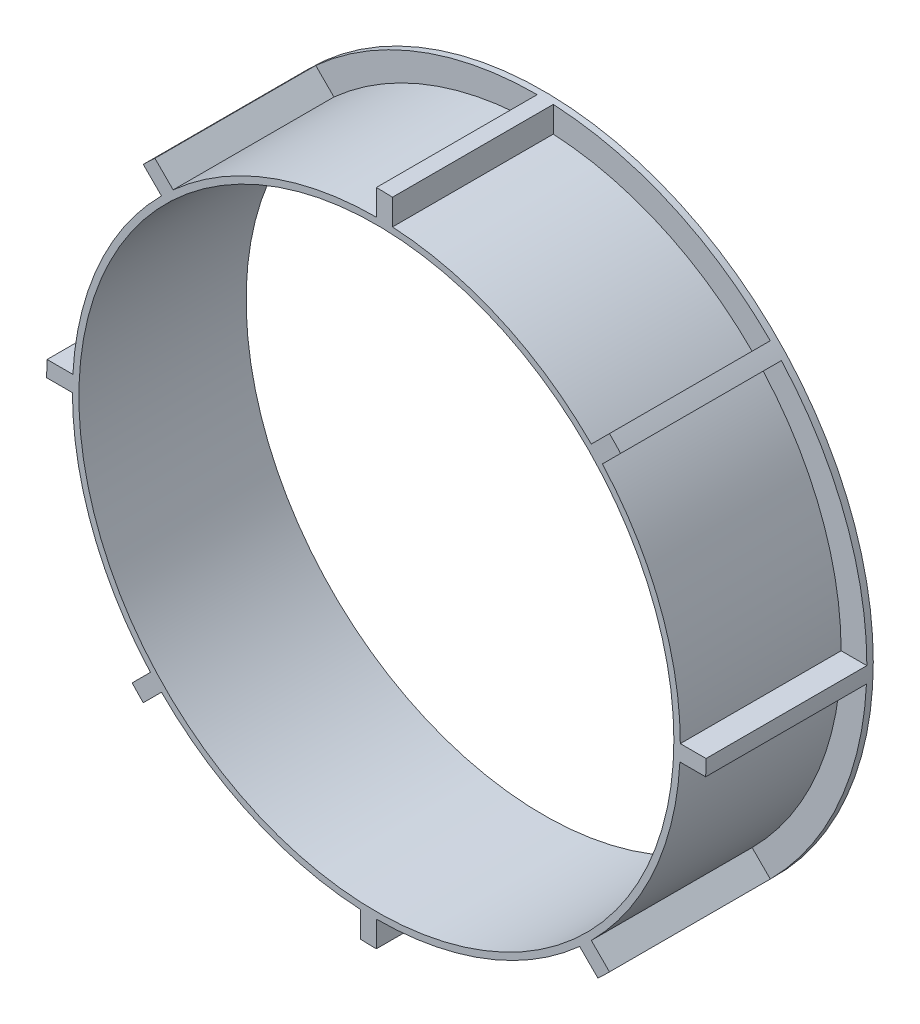
ISO-10303-21;
HEADER;
FILE_DESCRIPTION(('STEP AP214'),'2;1');
FILE_NAME('part.step','',(''),(''),'','','');
FILE_SCHEMA(('AUTOMOTIVE_DESIGN { 1 0 10303 214 1 1 1 1 }'));
ENDSEC;
DATA;
#1=APPLICATION_CONTEXT('core data for automotive mechanical design processes');
#2=APPLICATION_PROTOCOL_DEFINITION('international standard','automotive_design',2000,#1);
#3=PRODUCT_CONTEXT('',#1,'mechanical');
#4=PRODUCT('Part','Part','',(#3));
#5=PRODUCT_RELATED_PRODUCT_CATEGORY('part','',(#4));
#6=PRODUCT_DEFINITION_FORMATION('','',#4);
#7=PRODUCT_DEFINITION_CONTEXT('part definition',#1,'design');
#8=PRODUCT_DEFINITION('design','',#6,#7);
#9=PRODUCT_DEFINITION_SHAPE('','',#8);
#10=(LENGTH_UNIT() NAMED_UNIT(*) SI_UNIT(.MILLI.,.METRE.));
#11=(NAMED_UNIT(*) PLANE_ANGLE_UNIT() SI_UNIT($,.RADIAN.));
#12=(NAMED_UNIT(*) SI_UNIT($,.STERADIAN.) SOLID_ANGLE_UNIT());
#13=UNCERTAINTY_MEASURE_WITH_UNIT(LENGTH_MEASURE(1.E-05),#10,'distance_accuracy_value','');
#14=(GEOMETRIC_REPRESENTATION_CONTEXT(3) GLOBAL_UNCERTAINTY_ASSIGNED_CONTEXT((#13)) GLOBAL_UNIT_ASSIGNED_CONTEXT((#10,
#11,#12)) REPRESENTATION_CONTEXT('',''));
#15=CARTESIAN_POINT('',(0.,0.,0.));
#16=DIRECTION('',(0.,0.,1.));
#17=DIRECTION('',(1.,0.,0.));
#18=AXIS2_PLACEMENT_3D('',#15,#16,#17);
#19=CARTESIAN_POINT('',(0.,0.,2.));
#20=DIRECTION('',(0.,0.,1.));
#21=DIRECTION('',(1.,0.,0.));
#22=AXIS2_PLACEMENT_3D('',#19,#20,#21);
#23=PLANE('',#22);
#24=CARTESIAN_POINT('',(0.,0.,2.));
#25=DIRECTION('',(0.,0.,1.));
#26=DIRECTION('',(1.,0.,0.));
#27=AXIS2_PLACEMENT_3D('',#24,#25,#26);
#28=CIRCLE('',#27,102.5);
#29=CARTESIAN_POINT('',(0.,102.5,2.));
#30=VERTEX_POINT('',#29);
#31=CARTESIAN_POINT('',(-68.8566272719176,75.9276950837849,2.));
#32=VERTEX_POINT('',#31);
#33=EDGE_CURVE('E11',#30,#32,#28,.T.);
#34=ORIENTED_EDGE('',*,*,#33,.T.);
#35=DIRECTION('',(-0.707106781186539,0.707106781186556,0.));
#36=VECTOR('',#35,1.);
#37=CARTESIAN_POINT('',(3.53553390593278,3.53553390593269,2.));
#38=LINE('',#37,#36);
#39=CARTESIAN_POINT('',(-63.1924587208493,70.2635265327164,2.));
#40=VERTEX_POINT('',#39);
#41=EDGE_CURVE('E462',#40,#32,#38,.T.);
#42=ORIENTED_EDGE('',*,*,#41,.F.);
#43=CARTESIAN_POINT('',(0.,0.,2.));
#44=DIRECTION('',(0.,0.,1.));
#45=DIRECTION('',(1.,0.,0.));
#46=AXIS2_PLACEMENT_3D('',#43,#44,#45);
#47=CIRCLE('',#46,94.5);
#48=CARTESIAN_POINT('',(0.,94.5,2.));
#49=VERTEX_POINT('',#48);
#50=EDGE_CURVE('E265',#49,#40,#47,.T.);
#51=ORIENTED_EDGE('',*,*,#50,.F.);
#52=DIRECTION('',(0.,1.,0.));
#53=VECTOR('',#52,1.);
#54=CARTESIAN_POINT('',(0.,0.,2.));
#55=LINE('',#54,#53);
#56=EDGE_CURVE('E302',#49,#30,#55,.T.);
#57=ORIENTED_EDGE('',*,*,#56,.T.);
#58=EDGE_LOOP('',(#34,#42,#51,#57));
#59=FACE_BOUND('',#58,.T.);
#60=ADVANCED_FACE('F37',(#59),#23,.T.);
#61=CARTESIAN_POINT('',(0.,0.,52.));
#62=DIRECTION('',(0.,0.,-1.));
#63=DIRECTION('',(-1.,0.,0.));
#64=AXIS2_PLACEMENT_3D('',#61,#62,#63);
#65=CYLINDRICAL_SURFACE('',#64,94.5);
#66=DIRECTION('',(0.,0.,-1.));
#67=VECTOR('',#66,1.);
#68=CARTESIAN_POINT('',(-63.1924587208493,70.2635265327164,52.));
#69=LINE('',#68,#67);
#70=CARTESIAN_POINT('',(-63.1924587208493,70.2635265327164,52.));
#71=VERTEX_POINT('',#70);
#72=EDGE_CURVE('E249',#71,#40,#69,.T.);
#73=ORIENTED_EDGE('',*,*,#72,.F.);
#74=CARTESIAN_POINT('',(0.,0.,52.));
#75=DIRECTION('',(0.,0.,1.));
#76=DIRECTION('',(1.,0.,0.));
#77=AXIS2_PLACEMENT_3D('',#74,#75,#76);
#78=CIRCLE('',#77,94.5);
#79=CARTESIAN_POINT('',(0.,94.5,52.));
#80=VERTEX_POINT('',#79);
#81=EDGE_CURVE('E263',#80,#71,#78,.T.);
#82=ORIENTED_EDGE('',*,*,#81,.F.);
#83=DIRECTION('',(0.,0.,-1.));
#84=VECTOR('',#83,1.);
#85=CARTESIAN_POINT('',(0.,94.5,52.));
#86=LINE('',#85,#84);
#87=EDGE_CURVE('E300',#80,#49,#86,.T.);
#88=ORIENTED_EDGE('',*,*,#87,.T.);
#89=ORIENTED_EDGE('',*,*,#50,.T.);
#90=EDGE_LOOP('',(#73,#82,#88,#89));
#91=FACE_BOUND('',#90,.T.);
#92=ADVANCED_FACE('F261',(#91),#65,.T.);
#93=DIRECTION('',(-0.707106781186539,0.707106781186556,0.));
#94=VECTOR('',#93,1.);
#95=CARTESIAN_POINT('',(0.,0.,2.));
#96=LINE('',#95,#94);
#97=CARTESIAN_POINT('',(-66.8215908221279,66.8215908221296,2.));
#98=VERTEX_POINT('',#97);
#99=CARTESIAN_POINT('',(-72.4784450716202,72.478445071622,2.));
#100=VERTEX_POINT('',#99);
#101=EDGE_CURVE('E256',#98,#100,#96,.T.);
#102=ORIENTED_EDGE('',*,*,#101,.T.);
#103=CARTESIAN_POINT('',(-102.377976147216,5.00000000000107,2.));
#104=VERTEX_POINT('',#103);
#105=EDGE_CURVE('E46',#100,#104,#28,.T.);
#106=ORIENTED_EDGE('',*,*,#105,.T.);
#107=DIRECTION('',(-1.,0.,0.));
#108=VECTOR('',#107,1.);
#109=CARTESIAN_POINT('',(0.,5.,2.));
#110=LINE('',#109,#108);
#111=CARTESIAN_POINT('',(-94.3676321627283,5.00000000000099,2.));
#112=VERTEX_POINT('',#111);
#113=EDGE_CURVE('E266',#112,#104,#110,.T.);
#114=ORIENTED_EDGE('',*,*,#113,.F.);
#115=EDGE_CURVE('E289',#98,#112,#47,.T.);
#116=ORIENTED_EDGE('',*,*,#115,.F.);
#117=EDGE_LOOP('',(#102,#106,#114,#116));
#118=FACE_BOUND('',#117,.T.);
#119=ADVANCED_FACE('F556',(#118),#23,.T.);
#120=CARTESIAN_POINT('',(-66.8215908221279,66.8215908221296,52.));
#121=VERTEX_POINT('',#120);
#122=CARTESIAN_POINT('',(-94.3676321627283,5.00000000000099,52.));
#123=VERTEX_POINT('',#122);
#124=EDGE_CURVE('E273',#121,#123,#78,.T.);
#125=ORIENTED_EDGE('',*,*,#124,.F.);
#126=DIRECTION('',(0.,0.,-1.));
#127=VECTOR('',#126,1.);
#128=CARTESIAN_POINT('',(-66.8215908221279,66.8215908221296,52.));
#129=LINE('',#128,#127);
#130=EDGE_CURVE('E457',#121,#98,#129,.T.);
#131=ORIENTED_EDGE('',*,*,#130,.T.);
#132=ORIENTED_EDGE('',*,*,#115,.T.);
#133=DIRECTION('',(0.,0.,-1.));
#134=VECTOR('',#133,1.);
#135=CARTESIAN_POINT('',(-94.3676321627283,5.00000000000099,52.));
#136=LINE('',#135,#134);
#137=EDGE_CURVE('E428',#123,#112,#136,.T.);
#138=ORIENTED_EDGE('',*,*,#137,.F.);
#139=EDGE_LOOP('',(#125,#131,#132,#138));
#140=FACE_BOUND('',#139,.T.);
#141=ADVANCED_FACE('F476',(#140),#65,.T.);
#142=DIRECTION('',(-1.,0.,0.));
#143=VECTOR('',#142,1.);
#144=CARTESIAN_POINT('',(0.,0.,2.));
#145=LINE('',#144,#143);
#146=CARTESIAN_POINT('',(-94.5,9.89834959562028E-13,2.));
#147=VERTEX_POINT('',#146);
#148=CARTESIAN_POINT('',(-102.5,1.07363051169426E-12,2.));
#149=VERTEX_POINT('',#148);
#150=EDGE_CURVE('E444',#147,#149,#145,.T.);
#151=ORIENTED_EDGE('',*,*,#150,.T.);
#152=CARTESIAN_POINT('',(-75.9276950837846,-68.8566272719179,2.));
#153=VERTEX_POINT('',#152);
#154=EDGE_CURVE('E485',#149,#153,#28,.T.);
#155=ORIENTED_EDGE('',*,*,#154,.T.);
#156=DIRECTION('',(-0.707106781186554,-0.707106781186541,0.));
#157=VECTOR('',#156,1.);
#158=CARTESIAN_POINT('',(-3.53553390593271,3.53553390593277,2.));
#159=LINE('',#158,#157);
#160=CARTESIAN_POINT('',(-70.2635265327162,-63.1924587208496,2.));
#161=VERTEX_POINT('',#160);
#162=EDGE_CURVE('E425',#161,#153,#159,.T.);
#163=ORIENTED_EDGE('',*,*,#162,.F.);
#164=EDGE_CURVE('E602',#147,#161,#47,.T.);
#165=ORIENTED_EDGE('',*,*,#164,.F.);
#166=EDGE_LOOP('',(#151,#155,#163,#165));
#167=FACE_BOUND('',#166,.T.);
#168=ADVANCED_FACE('F562',(#167),#23,.T.);
#169=CARTESIAN_POINT('',(-94.5,9.89834959562028E-13,52.));
#170=VERTEX_POINT('',#169);
#171=CARTESIAN_POINT('',(-70.2635265327162,-63.1924587208496,52.));
#172=VERTEX_POINT('',#171);
#173=EDGE_CURVE('E278',#170,#172,#78,.T.);
#174=ORIENTED_EDGE('',*,*,#173,.F.);
#175=DIRECTION('',(0.,0.,-1.));
#176=VECTOR('',#175,1.);
#177=CARTESIAN_POINT('',(-94.5,9.89834959562028E-13,52.));
#178=LINE('',#177,#176);
#179=EDGE_CURVE('E441',#170,#147,#178,.T.);
#180=ORIENTED_EDGE('',*,*,#179,.T.);
#181=ORIENTED_EDGE('',*,*,#164,.T.);
#182=DIRECTION('',(0.,0.,-1.));
#183=VECTOR('',#182,1.);
#184=CARTESIAN_POINT('',(-70.2635265327162,-63.1924587208496,52.));
#185=LINE('',#184,#183);
#186=EDGE_CURVE('E404',#172,#161,#185,.T.);
#187=ORIENTED_EDGE('',*,*,#186,.F.);
#188=EDGE_LOOP('',(#174,#180,#181,#187));
#189=FACE_BOUND('',#188,.T.);
#190=ADVANCED_FACE('F492',(#189),#65,.T.);
#191=DIRECTION('',(-0.707106781186554,-0.707106781186541,0.));
#192=VECTOR('',#191,1.);
#193=CARTESIAN_POINT('',(0.,0.,2.));
#194=LINE('',#193,#192);
#195=CARTESIAN_POINT('',(-66.8215908221293,-66.8215908221281,2.));
#196=VERTEX_POINT('',#195);
#197=CARTESIAN_POINT('',(-72.4784450716217,-72.4784450716205,2.));
#198=VERTEX_POINT('',#197);
#199=EDGE_CURVE('E421',#196,#198,#194,.T.);
#200=ORIENTED_EDGE('',*,*,#199,.T.);
#201=CARTESIAN_POINT('',(-5.,-102.377976147216,2.));
#202=VERTEX_POINT('',#201);
#203=EDGE_CURVE('E611',#198,#202,#28,.T.);
#204=ORIENTED_EDGE('',*,*,#203,.T.);
#205=DIRECTION('',(0.,-1.,0.));
#206=VECTOR('',#205,1.);
#207=CARTESIAN_POINT('',(-5.,0.,2.));
#208=LINE('',#207,#206);
#209=CARTESIAN_POINT('',(-5.,-94.3676321627283,2.));
#210=VERTEX_POINT('',#209);
#211=EDGE_CURVE('E401',#210,#202,#208,.T.);
#212=ORIENTED_EDGE('',*,*,#211,.F.);
#213=EDGE_CURVE('E516',#196,#210,#47,.T.);
#214=ORIENTED_EDGE('',*,*,#213,.F.);
#215=EDGE_LOOP('',(#200,#204,#212,#214));
#216=FACE_BOUND('',#215,.T.);
#217=ADVANCED_FACE('F586',(#216),#23,.T.);
#218=CARTESIAN_POINT('',(-66.8215908221293,-66.8215908221281,52.));
#219=VERTEX_POINT('',#218);
#220=CARTESIAN_POINT('',(-5.,-94.3676321627283,52.));
#221=VERTEX_POINT('',#220);
#222=EDGE_CURVE('E494',#219,#221,#78,.T.);
#223=ORIENTED_EDGE('',*,*,#222,.F.);
#224=DIRECTION('',(0.,0.,-1.));
#225=VECTOR('',#224,1.);
#226=CARTESIAN_POINT('',(-66.8215908221293,-66.8215908221281,52.));
#227=LINE('',#226,#225);
#228=EDGE_CURVE('E417',#219,#196,#227,.T.);
#229=ORIENTED_EDGE('',*,*,#228,.T.);
#230=ORIENTED_EDGE('',*,*,#213,.T.);
#231=DIRECTION('',(0.,0.,-1.));
#232=VECTOR('',#231,1.);
#233=CARTESIAN_POINT('',(-5.,-94.3676321627283,52.));
#234=LINE('',#233,#232);
#235=EDGE_CURVE('E380',#221,#210,#234,.T.);
#236=ORIENTED_EDGE('',*,*,#235,.F.);
#237=EDGE_LOOP('',(#223,#229,#230,#236));
#238=FACE_BOUND('',#237,.T.);
#239=ADVANCED_FACE('F583',(#238),#65,.T.);
#240=DIRECTION('',(0.,-1.,0.));
#241=VECTOR('',#240,1.);
#242=CARTESIAN_POINT('',(0.,0.,2.));
#243=LINE('',#242,#241);
#244=CARTESIAN_POINT('',(0.,-94.5,2.));
#245=VERTEX_POINT('',#244);
#246=CARTESIAN_POINT('',(0.,-102.5,2.));
#247=VERTEX_POINT('',#246);
#248=EDGE_CURVE('E397',#245,#247,#243,.T.);
#249=ORIENTED_EDGE('',*,*,#248,.T.);
#250=CARTESIAN_POINT('',(68.8566272719181,-75.9276950837844,2.));
#251=VERTEX_POINT('',#250);
#252=EDGE_CURVE('E613',#247,#251,#28,.T.);
#253=ORIENTED_EDGE('',*,*,#252,.T.);
#254=DIRECTION('',(0.707106781186544,-0.707106781186551,0.));
#255=VECTOR('',#254,1.);
#256=CARTESIAN_POINT('',(-3.53553390593276,-3.53553390593272,2.));
#257=LINE('',#256,#255);
#258=CARTESIAN_POINT('',(63.1924587208498,-70.263526532716,2.));
#259=VERTEX_POINT('',#258);
#260=EDGE_CURVE('E377',#259,#251,#257,.T.);
#261=ORIENTED_EDGE('',*,*,#260,.F.);
#262=EDGE_CURVE('E514',#245,#259,#47,.T.);
#263=ORIENTED_EDGE('',*,*,#262,.F.);
#264=EDGE_LOOP('',(#249,#253,#261,#263));
#265=FACE_BOUND('',#264,.T.);
#266=ADVANCED_FACE('F578',(#265),#23,.T.);
#267=CARTESIAN_POINT('',(0.,-94.5,52.));
#268=VERTEX_POINT('',#267);
#269=CARTESIAN_POINT('',(63.1924587208498,-70.263526532716,52.));
#270=VERTEX_POINT('',#269);
#271=EDGE_CURVE('E495',#268,#270,#78,.T.);
#272=ORIENTED_EDGE('',*,*,#271,.F.);
#273=DIRECTION('',(0.,0.,-1.));
#274=VECTOR('',#273,1.);
#275=CARTESIAN_POINT('',(0.,-94.5,52.));
#276=LINE('',#275,#274);
#277=EDGE_CURVE('E393',#268,#245,#276,.T.);
#278=ORIENTED_EDGE('',*,*,#277,.T.);
#279=ORIENTED_EDGE('',*,*,#262,.T.);
#280=DIRECTION('',(0.,0.,-1.));
#281=VECTOR('',#280,1.);
#282=CARTESIAN_POINT('',(63.1924587208498,-70.263526532716,52.));
#283=LINE('',#282,#281);
#284=EDGE_CURVE('E356',#270,#259,#283,.T.);
#285=ORIENTED_EDGE('',*,*,#284,.F.);
#286=EDGE_LOOP('',(#272,#278,#279,#285));
#287=FACE_BOUND('',#286,.T.);
#288=ADVANCED_FACE('F576',(#287),#65,.T.);
#289=DIRECTION('',(0.707106781186544,-0.707106781186551,0.));
#290=VECTOR('',#289,1.);
#291=CARTESIAN_POINT('',(0.,0.,2.));
#292=LINE('',#291,#290);
#293=CARTESIAN_POINT('',(66.8215908221284,-66.8215908221291,2.));
#294=VERTEX_POINT('',#293);
#295=CARTESIAN_POINT('',(72.4784450716207,-72.4784450716215,2.));
#296=VERTEX_POINT('',#295);
#297=EDGE_CURVE('E373',#294,#296,#292,.T.);
#298=ORIENTED_EDGE('',*,*,#297,.T.);
#299=CARTESIAN_POINT('',(102.377976147216,-5.00000000000036,2.));
#300=VERTEX_POINT('',#299);
#301=EDGE_CURVE('E534',#296,#300,#28,.T.);
#302=ORIENTED_EDGE('',*,*,#301,.T.);
#303=DIRECTION('',(1.,0.,0.));
#304=VECTOR('',#303,1.);
#305=CARTESIAN_POINT('',(0.,-5.,2.));
#306=LINE('',#305,#304);
#307=CARTESIAN_POINT('',(94.3676321627283,-5.00000000000033,2.));
#308=VERTEX_POINT('',#307);
#309=EDGE_CURVE('E353',#308,#300,#306,.T.);
#310=ORIENTED_EDGE('',*,*,#309,.F.);
#311=EDGE_CURVE('E512',#294,#308,#47,.T.);
#312=ORIENTED_EDGE('',*,*,#311,.F.);
#313=EDGE_LOOP('',(#298,#302,#310,#312));
#314=FACE_BOUND('',#313,.T.);
#315=ADVANCED_FACE('F572',(#314),#23,.T.);
#316=CARTESIAN_POINT('',(66.8215908221284,-66.8215908221291,52.));
#317=VERTEX_POINT('',#316);
#318=CARTESIAN_POINT('',(94.3676321627283,-5.00000000000033,52.));
#319=VERTEX_POINT('',#318);
#320=EDGE_CURVE('E285',#317,#319,#78,.T.);
#321=ORIENTED_EDGE('',*,*,#320,.F.);
#322=DIRECTION('',(0.,0.,-1.));
#323=VECTOR('',#322,1.);
#324=CARTESIAN_POINT('',(66.8215908221284,-66.8215908221291,52.));
#325=LINE('',#324,#323);
#326=EDGE_CURVE('E369',#317,#294,#325,.T.);
#327=ORIENTED_EDGE('',*,*,#326,.T.);
#328=ORIENTED_EDGE('',*,*,#311,.T.);
#329=DIRECTION('',(0.,0.,-1.));
#330=VECTOR('',#329,1.);
#331=CARTESIAN_POINT('',(94.3676321627283,-5.00000000000033,52.));
#332=LINE('',#331,#330);
#333=EDGE_CURVE('E332',#319,#308,#332,.T.);
#334=ORIENTED_EDGE('',*,*,#333,.F.);
#335=EDGE_LOOP('',(#321,#327,#328,#334));
#336=FACE_BOUND('',#335,.T.);
#337=ADVANCED_FACE('F510',(#336),#65,.T.);
#338=DIRECTION('',(1.,0.,0.));
#339=VECTOR('',#338,1.);
#340=CARTESIAN_POINT('',(0.,0.,2.));
#341=LINE('',#340,#339);
#342=CARTESIAN_POINT('',(94.5,-3.29944986520676E-13,2.));
#343=VERTEX_POINT('',#342);
#344=CARTESIAN_POINT('',(102.5,-3.57876837231421E-13,2.));
#345=VERTEX_POINT('',#344);
#346=EDGE_CURVE('E349',#343,#345,#341,.T.);
#347=ORIENTED_EDGE('',*,*,#346,.T.);
#348=CARTESIAN_POINT('',(75.9276950837841,68.8566272719184,2.));
#349=VERTEX_POINT('',#348);
#350=EDGE_CURVE('E533',#345,#349,#28,.T.);
#351=ORIENTED_EDGE('',*,*,#350,.T.);
#352=DIRECTION('',(0.707106781186549,0.707106781186546,0.));
#353=VECTOR('',#352,1.);
#354=CARTESIAN_POINT('',(3.53553390593273,-3.53553390593274,2.));
#355=LINE('',#354,#353);
#356=CARTESIAN_POINT('',(70.2635265327158,63.1924587208501,2.));
#357=VERTEX_POINT('',#356);
#358=EDGE_CURVE('E329',#357,#349,#355,.T.);
#359=ORIENTED_EDGE('',*,*,#358,.F.);
#360=EDGE_CURVE('E515',#343,#357,#47,.T.);
#361=ORIENTED_EDGE('',*,*,#360,.F.);
#362=EDGE_LOOP('',(#347,#351,#359,#361));
#363=FACE_BOUND('',#362,.T.);
#364=ADVANCED_FACE('F565',(#363),#23,.T.);
#365=CARTESIAN_POINT('',(94.5,0.,52.));
#366=VERTEX_POINT('',#365);
#367=CARTESIAN_POINT('',(70.2635265327158,63.1924587208501,52.));
#368=VERTEX_POINT('',#367);
#369=EDGE_CURVE('E281',#366,#368,#78,.T.);
#370=ORIENTED_EDGE('',*,*,#369,.F.);
#371=DIRECTION('',(0.,0.,-1.));
#372=VECTOR('',#371,1.);
#373=CARTESIAN_POINT('',(94.5,-3.29944986520676E-13,52.));
#374=LINE('',#373,#372);
#375=EDGE_CURVE('E345',#366,#343,#374,.T.);
#376=ORIENTED_EDGE('',*,*,#375,.T.);
#377=ORIENTED_EDGE('',*,*,#360,.T.);
#378=DIRECTION('',(0.,0.,-1.));
#379=VECTOR('',#378,1.);
#380=CARTESIAN_POINT('',(70.2635265327158,63.1924587208501,52.));
#381=LINE('',#380,#379);
#382=EDGE_CURVE('E309',#368,#357,#381,.T.);
#383=ORIENTED_EDGE('',*,*,#382,.F.);
#384=EDGE_LOOP('',(#370,#376,#377,#383));
#385=FACE_BOUND('',#384,.T.);
#386=ADVANCED_FACE('F564',(#385),#65,.T.);
#387=DIRECTION('',(0.707106781186549,0.707106781186546,0.));
#388=VECTOR('',#387,1.);
#389=CARTESIAN_POINT('',(0.,0.,2.));
#390=LINE('',#389,#388);
#391=CARTESIAN_POINT('',(66.8215908221289,66.8215908221286,2.));
#392=VERTEX_POINT('',#391);
#393=CARTESIAN_POINT('',(72.4784450716212,72.478445071621,2.));
#394=VERTEX_POINT('',#393);
#395=EDGE_CURVE('E325',#392,#394,#390,.T.);
#396=ORIENTED_EDGE('',*,*,#395,.T.);
#397=CARTESIAN_POINT('',(5.,102.377976147216,2.));
#398=VERTEX_POINT('',#397);
#399=EDGE_CURVE('E47',#394,#398,#28,.T.);
#400=ORIENTED_EDGE('',*,*,#399,.T.);
#401=DIRECTION('',(0.,1.,0.));
#402=VECTOR('',#401,1.);
#403=CARTESIAN_POINT('',(5.,0.,2.));
#404=LINE('',#403,#402);
#405=CARTESIAN_POINT('',(5.,94.3676321627283,2.));
#406=VERTEX_POINT('',#405);
#407=EDGE_CURVE('E306',#406,#398,#404,.T.);
#408=ORIENTED_EDGE('',*,*,#407,.F.);
#409=EDGE_CURVE('E290',#392,#406,#47,.T.);
#410=ORIENTED_EDGE('',*,*,#409,.F.);
#411=EDGE_LOOP('',(#396,#400,#408,#410));
#412=FACE_BOUND('',#411,.T.);
#413=ADVANCED_FACE('F530',(#412),#23,.T.);
#414=CARTESIAN_POINT('',(66.8215908221289,66.8215908221286,52.));
#415=VERTEX_POINT('',#414);
#416=CARTESIAN_POINT('',(5.,94.3676321627283,52.));
#417=VERTEX_POINT('',#416);
#418=EDGE_CURVE('E275',#415,#417,#78,.T.);
#419=ORIENTED_EDGE('',*,*,#418,.F.);
#420=DIRECTION('',(0.,0.,-1.));
#421=VECTOR('',#420,1.);
#422=CARTESIAN_POINT('',(66.8215908221289,66.8215908221286,52.));
#423=LINE('',#422,#421);
#424=EDGE_CURVE('E321',#415,#392,#423,.T.);
#425=ORIENTED_EDGE('',*,*,#424,.T.);
#426=ORIENTED_EDGE('',*,*,#409,.T.);
#427=DIRECTION('',(0.,0.,-1.));
#428=VECTOR('',#427,1.);
#429=CARTESIAN_POINT('',(5.,94.3676321627283,52.));
#430=LINE('',#429,#428);
#431=EDGE_CURVE('E292',#417,#406,#430,.T.);
#432=ORIENTED_EDGE('',*,*,#431,.F.);
#433=EDGE_LOOP('',(#419,#425,#426,#432));
#434=FACE_BOUND('',#433,.T.);
#435=ADVANCED_FACE('F523',(#434),#65,.T.);
#436=CARTESIAN_POINT('',(0.,0.,0.));
#437=DIRECTION('',(0.,0.,1.));
#438=DIRECTION('',(1.,0.,0.));
#439=AXIS2_PLACEMENT_3D('',#436,#437,#438);
#440=PLANE('',#439);
#441=CARTESIAN_POINT('',(0.,0.,0.));
#442=DIRECTION('',(0.,0.,1.));
#443=DIRECTION('',(1.,0.,0.));
#444=AXIS2_PLACEMENT_3D('',#441,#442,#443);
#445=CIRCLE('',#444,102.5);
#446=CARTESIAN_POINT('',(102.5,0.,0.));
#447=VERTEX_POINT('',#446);
#448=EDGE_CURVE('E41',#447,#447,#445,.T.);
#449=ORIENTED_EDGE('',*,*,#448,.F.);
#450=EDGE_LOOP('',(#449));
#451=FACE_BOUND('',#450,.T.);
#452=CARTESIAN_POINT('',(0.,0.,0.));
#453=DIRECTION('',(0.,0.,1.));
#454=DIRECTION('',(1.,0.,0.));
#455=AXIS2_PLACEMENT_3D('',#452,#453,#454);
#456=CIRCLE('',#455,92.5);
#457=CARTESIAN_POINT('',(92.5,0.,0.));
#458=VERTEX_POINT('',#457);
#459=EDGE_CURVE('E272',#458,#458,#456,.T.);
#460=ORIENTED_EDGE('',*,*,#459,.T.);
#461=EDGE_LOOP('',(#460));
#462=FACE_BOUND('',#461,.T.);
#463=ADVANCED_FACE('F538',(#451,#462),#440,.F.);
#464=CARTESIAN_POINT('',(0.,0.,2.));
#465=DIRECTION('',(0.,0.,-1.));
#466=DIRECTION('',(-1.,0.,0.));
#467=AXIS2_PLACEMENT_3D('',#464,#465,#466);
#468=CYLINDRICAL_SURFACE('',#467,102.5);
#469=ORIENTED_EDGE('',*,*,#33,.F.);
#470=DIRECTION('',(0.,0.,-1.));
#471=VECTOR('',#470,1.);
#472=CARTESIAN_POINT('',(0.,102.5,52.));
#473=LINE('',#472,#471);
#474=CARTESIAN_POINT('',(0.,102.5,52.));
#475=VERTEX_POINT('',#474);
#476=EDGE_CURVE('E298',#475,#30,#473,.T.);
#477=ORIENTED_EDGE('',*,*,#476,.F.);
#478=CARTESIAN_POINT('',(0.,0.,52.));
#479=DIRECTION('',(0.,0.,1.));
#480=DIRECTION('',(1.,0.,0.));
#481=AXIS2_PLACEMENT_3D('',#478,#479,#480);
#482=CIRCLE('',#481,102.5);
#483=CARTESIAN_POINT('',(5.,102.377976147216,52.));
#484=VERTEX_POINT('',#483);
#485=EDGE_CURVE('E311',#484,#475,#482,.T.);
#486=ORIENTED_EDGE('',*,*,#485,.F.);
#487=DIRECTION('',(0.,0.,-1.));
#488=VECTOR('',#487,1.);
#489=CARTESIAN_POINT('',(5.,102.377976147216,52.));
#490=LINE('',#489,#488);
#491=EDGE_CURVE('E295',#484,#398,#490,.T.);
#492=ORIENTED_EDGE('',*,*,#491,.T.);
#493=ORIENTED_EDGE('',*,*,#399,.F.);
#494=DIRECTION('',(0.,0.,-1.));
#495=VECTOR('',#494,1.);
#496=CARTESIAN_POINT('',(72.4784450716212,72.478445071621,52.));
#497=LINE('',#496,#495);
#498=CARTESIAN_POINT('',(72.4784450716212,72.478445071621,52.));
#499=VERTEX_POINT('',#498);
#500=EDGE_CURVE('E319',#499,#394,#497,.T.);
#501=ORIENTED_EDGE('',*,*,#500,.F.);
#502=CARTESIAN_POINT('',(0.,0.,52.));
#503=DIRECTION('',(0.,0.,1.));
#504=DIRECTION('',(0.707106781186546,-0.707106781186549,0.));
#505=AXIS2_PLACEMENT_3D('',#502,#503,#504);
#506=CIRCLE('',#505,102.5);
#507=CARTESIAN_POINT('',(75.9276950837841,68.8566272719184,52.));
#508=VERTEX_POINT('',#507);
#509=EDGE_CURVE('E335',#508,#499,#506,.T.);
#510=ORIENTED_EDGE('',*,*,#509,.F.);
#511=DIRECTION('',(0.,0.,-1.));
#512=VECTOR('',#511,1.);
#513=CARTESIAN_POINT('',(75.9276950837841,68.8566272719184,52.));
#514=LINE('',#513,#512);
#515=EDGE_CURVE('E316',#508,#349,#514,.T.);
#516=ORIENTED_EDGE('',*,*,#515,.T.);
#517=ORIENTED_EDGE('',*,*,#350,.F.);
#518=DIRECTION('',(0.,0.,-1.));
#519=VECTOR('',#518,1.);
#520=CARTESIAN_POINT('',(102.5,-3.57876837231421E-13,52.));
#521=LINE('',#520,#519);
#522=CARTESIAN_POINT('',(102.5,-3.57876837231421E-13,52.));
#523=VERTEX_POINT('',#522);
#524=EDGE_CURVE('E343',#523,#345,#521,.T.);
#525=ORIENTED_EDGE('',*,*,#524,.F.);
#526=CARTESIAN_POINT('',(0.,0.,52.));
#527=DIRECTION('',(0.,0.,1.));
#528=DIRECTION('',(0.,-1.,0.));
#529=AXIS2_PLACEMENT_3D('',#526,#527,#528);
#530=CIRCLE('',#529,102.5);
#531=CARTESIAN_POINT('',(102.377976147216,-5.00000000000036,52.));
#532=VERTEX_POINT('',#531);
#533=EDGE_CURVE('E359',#532,#523,#530,.T.);
#534=ORIENTED_EDGE('',*,*,#533,.F.);
#535=DIRECTION('',(0.,0.,-1.));
#536=VECTOR('',#535,1.);
#537=CARTESIAN_POINT('',(102.377976147216,-5.00000000000036,52.));
#538=LINE('',#537,#536);
#539=EDGE_CURVE('E340',#532,#300,#538,.T.);
#540=ORIENTED_EDGE('',*,*,#539,.T.);
#541=ORIENTED_EDGE('',*,*,#301,.F.);
#542=DIRECTION('',(0.,0.,-1.));
#543=VECTOR('',#542,1.);
#544=CARTESIAN_POINT('',(72.4784450716207,-72.4784450716215,52.));
#545=LINE('',#544,#543);
#546=CARTESIAN_POINT('',(72.4784450716207,-72.4784450716215,52.));
#547=VERTEX_POINT('',#546);
#548=EDGE_CURVE('E367',#547,#296,#545,.T.);
#549=ORIENTED_EDGE('',*,*,#548,.F.);
#550=CARTESIAN_POINT('',(0.,0.,52.));
#551=DIRECTION('',(0.,0.,1.));
#552=DIRECTION('',(-0.707106781186551,-0.707106781186544,0.));
#553=AXIS2_PLACEMENT_3D('',#550,#551,#552);
#554=CIRCLE('',#553,102.5);
#555=CARTESIAN_POINT('',(68.8566272719181,-75.9276950837844,52.));
#556=VERTEX_POINT('',#555);
#557=EDGE_CURVE('E383',#556,#547,#554,.T.);
#558=ORIENTED_EDGE('',*,*,#557,.F.);
#559=DIRECTION('',(0.,0.,-1.));
#560=VECTOR('',#559,1.);
#561=CARTESIAN_POINT('',(68.8566272719181,-75.9276950837844,52.));
#562=LINE('',#561,#560);
#563=EDGE_CURVE('E364',#556,#251,#562,.T.);
#564=ORIENTED_EDGE('',*,*,#563,.T.);
#565=ORIENTED_EDGE('',*,*,#252,.F.);
#566=DIRECTION('',(0.,0.,-1.));
#567=VECTOR('',#566,1.);
#568=CARTESIAN_POINT('',(0.,-102.5,52.));
#569=LINE('',#568,#567);
#570=CARTESIAN_POINT('',(0.,-102.5,52.));
#571=VERTEX_POINT('',#570);
#572=EDGE_CURVE('E391',#571,#247,#569,.T.);
#573=ORIENTED_EDGE('',*,*,#572,.F.);
#574=CARTESIAN_POINT('',(0.,0.,52.));
#575=DIRECTION('',(0.,0.,1.));
#576=DIRECTION('',(-1.,0.,0.));
#577=AXIS2_PLACEMENT_3D('',#574,#575,#576);
#578=CIRCLE('',#577,102.5);
#579=CARTESIAN_POINT('',(-5.,-102.377976147216,52.));
#580=VERTEX_POINT('',#579);
#581=EDGE_CURVE('E407',#580,#571,#578,.T.);
#582=ORIENTED_EDGE('',*,*,#581,.F.);
#583=DIRECTION('',(0.,0.,-1.));
#584=VECTOR('',#583,1.);
#585=CARTESIAN_POINT('',(-5.,-102.377976147216,52.));
#586=LINE('',#585,#584);
#587=EDGE_CURVE('E388',#580,#202,#586,.T.);
#588=ORIENTED_EDGE('',*,*,#587,.T.);
#589=ORIENTED_EDGE('',*,*,#203,.F.);
#590=DIRECTION('',(0.,0.,-1.));
#591=VECTOR('',#590,1.);
#592=CARTESIAN_POINT('',(-72.4784450716217,-72.4784450716205,52.));
#593=LINE('',#592,#591);
#594=CARTESIAN_POINT('',(-72.4784450716217,-72.4784450716205,52.));
#595=VERTEX_POINT('',#594);
#596=EDGE_CURVE('E415',#595,#198,#593,.T.);
#597=ORIENTED_EDGE('',*,*,#596,.F.);
#598=CARTESIAN_POINT('',(0.,0.,52.));
#599=DIRECTION('',(0.,0.,1.));
#600=DIRECTION('',(-0.707106781186541,0.707106781186554,0.));
#601=AXIS2_PLACEMENT_3D('',#598,#599,#600);
#602=CIRCLE('',#601,102.5);
#603=CARTESIAN_POINT('',(-75.9276950837846,-68.8566272719179,52.));
#604=VERTEX_POINT('',#603);
#605=EDGE_CURVE('E431',#604,#595,#602,.T.);
#606=ORIENTED_EDGE('',*,*,#605,.F.);
#607=DIRECTION('',(0.,0.,-1.));
#608=VECTOR('',#607,1.);
#609=CARTESIAN_POINT('',(-75.9276950837846,-68.8566272719179,52.));
#610=LINE('',#609,#608);
#611=EDGE_CURVE('E412',#604,#153,#610,.T.);
#612=ORIENTED_EDGE('',*,*,#611,.T.);
#613=ORIENTED_EDGE('',*,*,#154,.F.);
#614=DIRECTION('',(0.,0.,-1.));
#615=VECTOR('',#614,1.);
#616=CARTESIAN_POINT('',(-102.5,1.07363051169426E-12,52.));
#617=LINE('',#616,#615);
#618=CARTESIAN_POINT('',(-102.5,1.07363051169426E-12,52.));
#619=VERTEX_POINT('',#618);
#620=EDGE_CURVE('E439',#619,#149,#617,.T.);
#621=ORIENTED_EDGE('',*,*,#620,.F.);
#622=CARTESIAN_POINT('',(0.,0.,52.));
#623=DIRECTION('',(0.,0.,1.));
#624=DIRECTION('',(0.,1.,0.));
#625=AXIS2_PLACEMENT_3D('',#622,#623,#624);
#626=CIRCLE('',#625,102.5);
#627=CARTESIAN_POINT('',(-102.377976147216,5.00000000000107,52.));
#628=VERTEX_POINT('',#627);
#629=EDGE_CURVE('E451',#628,#619,#626,.T.);
#630=ORIENTED_EDGE('',*,*,#629,.F.);
#631=DIRECTION('',(0.,0.,-1.));
#632=VECTOR('',#631,1.);
#633=CARTESIAN_POINT('',(-102.377976147216,5.00000000000107,52.));
#634=LINE('',#633,#632);
#635=EDGE_CURVE('E436',#628,#104,#634,.T.);
#636=ORIENTED_EDGE('',*,*,#635,.T.);
#637=ORIENTED_EDGE('',*,*,#105,.F.);
#638=DIRECTION('',(0.,0.,-1.));
#639=VECTOR('',#638,1.);
#640=CARTESIAN_POINT('',(-72.4784450716202,72.478445071622,52.));
#641=LINE('',#640,#639);
#642=CARTESIAN_POINT('',(-72.4784450716202,72.478445071622,52.));
#643=VERTEX_POINT('',#642);
#644=EDGE_CURVE('E455',#643,#100,#641,.T.);
#645=ORIENTED_EDGE('',*,*,#644,.F.);
#646=CARTESIAN_POINT('',(0.,0.,52.));
#647=DIRECTION('',(0.,0.,1.));
#648=DIRECTION('',(0.707106781186556,0.707106781186539,0.));
#649=AXIS2_PLACEMENT_3D('',#646,#647,#648);
#650=CIRCLE('',#649,102.5);
#651=CARTESIAN_POINT('',(-68.8566272719176,75.9276950837849,52.));
#652=VERTEX_POINT('',#651);
#653=EDGE_CURVE('E255',#652,#643,#650,.T.);
#654=ORIENTED_EDGE('',*,*,#653,.F.);
#655=DIRECTION('',(0.,0.,-1.));
#656=VECTOR('',#655,1.);
#657=CARTESIAN_POINT('',(-68.8566272719176,75.9276950837849,52.));
#658=LINE('',#657,#656);
#659=EDGE_CURVE('E252',#652,#32,#658,.T.);
#660=ORIENTED_EDGE('',*,*,#659,.T.);
#661=EDGE_LOOP('',(#469,#477,#486,#492,#493,#501,#510,#516,#517,#525,#534,#540,#541,#549,#558,
#564,#565,#573,#582,#588,#589,#597,#606,#612,#613,#621,#630,#636,#637,#645,#654,#660));
#662=FACE_BOUND('',#661,.T.);
#663=ORIENTED_EDGE('',*,*,#448,.T.);
#664=EDGE_LOOP('',(#663));
#665=FACE_BOUND('',#664,.T.);
#666=ADVANCED_FACE('F39',(#662,#665),#468,.T.);
#667=CARTESIAN_POINT('',(0.,0.,2.));
#668=DIRECTION('',(0.,0.,-1.));
#669=DIRECTION('',(-1.,0.,0.));
#670=AXIS2_PLACEMENT_3D('',#667,#668,#669);
#671=CYLINDRICAL_SURFACE('',#670,92.5);
#672=ORIENTED_EDGE('',*,*,#459,.F.);
#673=EDGE_LOOP('',(#672));
#674=FACE_BOUND('',#673,.T.);
#675=CARTESIAN_POINT('',(0.,0.,52.));
#676=DIRECTION('',(0.,0.,1.));
#677=DIRECTION('',(1.,0.,0.));
#678=AXIS2_PLACEMENT_3D('',#675,#676,#677);
#679=CIRCLE('',#678,92.5);
#680=CARTESIAN_POINT('',(92.5,0.,52.));
#681=VERTEX_POINT('',#680);
#682=EDGE_CURVE('E282',#681,#681,#679,.F.);
#683=ORIENTED_EDGE('',*,*,#682,.F.);
#684=EDGE_LOOP('',(#683));
#685=FACE_BOUND('',#684,.T.);
#686=ADVANCED_FACE('F543',(#674,#685),#671,.F.);
#687=CARTESIAN_POINT('',(0.,0.,52.));
#688=DIRECTION('',(0.,0.,1.));
#689=DIRECTION('',(1.,0.,0.));
#690=AXIS2_PLACEMENT_3D('',#687,#688,#689);
#691=PLANE('',#690);
#692=ORIENTED_EDGE('',*,*,#682,.T.);
#693=EDGE_LOOP('',(#692));
#694=FACE_BOUND('',#693,.T.);
#695=ORIENTED_EDGE('',*,*,#81,.T.);
#696=DIRECTION('',(-0.707106781186539,0.707106781186556,0.));
#697=VECTOR('',#696,1.);
#698=CARTESIAN_POINT('',(3.53553390593278,3.53553390593269,52.));
#699=LINE('',#698,#697);
#700=EDGE_CURVE('E246',#71,#652,#699,.T.);
#701=ORIENTED_EDGE('',*,*,#700,.T.);
#702=ORIENTED_EDGE('',*,*,#653,.T.);
#703=DIRECTION('',(-0.707106781186539,0.707106781186556,0.));
#704=VECTOR('',#703,1.);
#705=CARTESIAN_POINT('',(0.,0.,52.));
#706=LINE('',#705,#704);
#707=EDGE_CURVE('E54',#121,#643,#706,.T.);
#708=ORIENTED_EDGE('',*,*,#707,.F.);
#709=ORIENTED_EDGE('',*,*,#124,.T.);
#710=DIRECTION('',(-1.,0.,0.));
#711=VECTOR('',#710,1.);
#712=CARTESIAN_POINT('',(0.,5.,52.));
#713=LINE('',#712,#711);
#714=EDGE_CURVE('E447',#123,#628,#713,.T.);
#715=ORIENTED_EDGE('',*,*,#714,.T.);
#716=ORIENTED_EDGE('',*,*,#629,.T.);
#717=DIRECTION('',(-1.,0.,0.));
#718=VECTOR('',#717,1.);
#719=CARTESIAN_POINT('',(0.,0.,52.));
#720=LINE('',#719,#718);
#721=EDGE_CURVE('E61',#170,#619,#720,.T.);
#722=ORIENTED_EDGE('',*,*,#721,.F.);
#723=ORIENTED_EDGE('',*,*,#173,.T.);
#724=DIRECTION('',(-0.707106781186554,-0.707106781186541,0.));
#725=VECTOR('',#724,1.);
#726=CARTESIAN_POINT('',(-3.53553390593271,3.53553390593277,52.));
#727=LINE('',#726,#725);
#728=EDGE_CURVE('E424',#172,#604,#727,.T.);
#729=ORIENTED_EDGE('',*,*,#728,.T.);
#730=ORIENTED_EDGE('',*,*,#605,.T.);
#731=DIRECTION('',(-0.707106781186554,-0.707106781186541,0.));
#732=VECTOR('',#731,1.);
#733=CARTESIAN_POINT('',(0.,0.,52.));
#734=LINE('',#733,#732);
#735=EDGE_CURVE('E420',#219,#595,#734,.T.);
#736=ORIENTED_EDGE('',*,*,#735,.F.);
#737=ORIENTED_EDGE('',*,*,#222,.T.);
#738=DIRECTION('',(0.,-1.,0.));
#739=VECTOR('',#738,1.);
#740=CARTESIAN_POINT('',(-5.,0.,52.));
#741=LINE('',#740,#739);
#742=EDGE_CURVE('E400',#221,#580,#741,.T.);
#743=ORIENTED_EDGE('',*,*,#742,.T.);
#744=ORIENTED_EDGE('',*,*,#581,.T.);
#745=DIRECTION('',(0.,-1.,0.));
#746=VECTOR('',#745,1.);
#747=CARTESIAN_POINT('',(0.,0.,52.));
#748=LINE('',#747,#746);
#749=EDGE_CURVE('E396',#268,#571,#748,.T.);
#750=ORIENTED_EDGE('',*,*,#749,.F.);
#751=ORIENTED_EDGE('',*,*,#271,.T.);
#752=DIRECTION('',(0.707106781186544,-0.707106781186551,0.));
#753=VECTOR('',#752,1.);
#754=CARTESIAN_POINT('',(-3.53553390593276,-3.53553390593272,52.));
#755=LINE('',#754,#753);
#756=EDGE_CURVE('E376',#270,#556,#755,.T.);
#757=ORIENTED_EDGE('',*,*,#756,.T.);
#758=ORIENTED_EDGE('',*,*,#557,.T.);
#759=DIRECTION('',(0.707106781186544,-0.707106781186551,0.));
#760=VECTOR('',#759,1.);
#761=CARTESIAN_POINT('',(0.,0.,52.));
#762=LINE('',#761,#760);
#763=EDGE_CURVE('E372',#317,#547,#762,.T.);
#764=ORIENTED_EDGE('',*,*,#763,.F.);
#765=ORIENTED_EDGE('',*,*,#320,.T.);
#766=DIRECTION('',(1.,0.,0.));
#767=VECTOR('',#766,1.);
#768=CARTESIAN_POINT('',(0.,-5.,52.));
#769=LINE('',#768,#767);
#770=EDGE_CURVE('E352',#319,#532,#769,.T.);
#771=ORIENTED_EDGE('',*,*,#770,.T.);
#772=ORIENTED_EDGE('',*,*,#533,.T.);
#773=DIRECTION('',(1.,0.,0.));
#774=VECTOR('',#773,1.);
#775=CARTESIAN_POINT('',(0.,0.,52.));
#776=LINE('',#775,#774);
#777=EDGE_CURVE('E348',#366,#523,#776,.T.);
#778=ORIENTED_EDGE('',*,*,#777,.F.);
#779=ORIENTED_EDGE('',*,*,#369,.T.);
#780=DIRECTION('',(0.707106781186549,0.707106781186546,0.));
#781=VECTOR('',#780,1.);
#782=CARTESIAN_POINT('',(3.53553390593273,-3.53553390593274,52.));
#783=LINE('',#782,#781);
#784=EDGE_CURVE('E328',#368,#508,#783,.T.);
#785=ORIENTED_EDGE('',*,*,#784,.T.);
#786=ORIENTED_EDGE('',*,*,#509,.T.);
#787=DIRECTION('',(0.707106781186549,0.707106781186546,0.));
#788=VECTOR('',#787,1.);
#789=CARTESIAN_POINT('',(0.,0.,52.));
#790=LINE('',#789,#788);
#791=EDGE_CURVE('E324',#415,#499,#790,.T.);
#792=ORIENTED_EDGE('',*,*,#791,.F.);
#793=ORIENTED_EDGE('',*,*,#418,.T.);
#794=DIRECTION('',(0.,1.,0.));
#795=VECTOR('',#794,1.);
#796=CARTESIAN_POINT('',(5.,0.,52.));
#797=LINE('',#796,#795);
#798=EDGE_CURVE('E305',#417,#484,#797,.T.);
#799=ORIENTED_EDGE('',*,*,#798,.T.);
#800=ORIENTED_EDGE('',*,*,#485,.T.);
#801=DIRECTION('',(0.,1.,0.));
#802=VECTOR('',#801,1.);
#803=CARTESIAN_POINT('',(0.,0.,52.));
#804=LINE('',#803,#802);
#805=EDGE_CURVE('E270',#80,#475,#804,.T.);
#806=ORIENTED_EDGE('',*,*,#805,.F.);
#807=EDGE_LOOP('',(#695,#701,#702,#708,#709,#715,#716,#722,#723,#729,#730,#736,#737,#743,#744,
#750,#751,#757,#758,#764,#765,#771,#772,#778,#779,#785,#786,#792,#793,#799,#800,#806));
#808=FACE_BOUND('',#807,.T.);
#809=ADVANCED_FACE('F268',(#694,#808),#691,.T.);
#810=CARTESIAN_POINT('',(5.,0.,52.));
#811=DIRECTION('',(-1.,0.,0.));
#812=DIRECTION('',(0.,0.,1.));
#813=AXIS2_PLACEMENT_3D('',#810,#811,#812);
#814=PLANE('',#813);
#815=ORIENTED_EDGE('',*,*,#407,.T.);
#816=ORIENTED_EDGE('',*,*,#491,.F.);
#817=ORIENTED_EDGE('',*,*,#798,.F.);
#818=ORIENTED_EDGE('',*,*,#431,.T.);
#819=EDGE_LOOP('',(#815,#816,#817,#818));
#820=FACE_BOUND('',#819,.T.);
#821=ADVANCED_FACE('F528',(#820),#814,.F.);
#822=CARTESIAN_POINT('',(0.,0.,52.));
#823=DIRECTION('',(-1.,0.,0.));
#824=DIRECTION('',(0.,0.,1.));
#825=AXIS2_PLACEMENT_3D('',#822,#823,#824);
#826=PLANE('',#825);
#827=ORIENTED_EDGE('',*,*,#56,.F.);
#828=ORIENTED_EDGE('',*,*,#87,.F.);
#829=ORIENTED_EDGE('',*,*,#805,.T.);
#830=ORIENTED_EDGE('',*,*,#476,.T.);
#831=EDGE_LOOP('',(#827,#828,#829,#830));
#832=FACE_BOUND('',#831,.T.);
#833=ADVANCED_FACE('F639',(#832),#826,.T.);
#834=CARTESIAN_POINT('',(3.53553390593273,-3.53553390593274,52.));
#835=DIRECTION('',(-0.707106781186546,0.707106781186549,0.));
#836=DIRECTION('',(-0.707106781186549,-0.707106781186546,0.));
#837=AXIS2_PLACEMENT_3D('',#834,#835,#836);
#838=PLANE('',#837);
#839=ORIENTED_EDGE('',*,*,#358,.T.);
#840=ORIENTED_EDGE('',*,*,#515,.F.);
#841=ORIENTED_EDGE('',*,*,#784,.F.);
#842=ORIENTED_EDGE('',*,*,#382,.T.);
#843=EDGE_LOOP('',(#839,#840,#841,#842));
#844=FACE_BOUND('',#843,.T.);
#845=ADVANCED_FACE('F627',(#844),#838,.F.);
#846=CARTESIAN_POINT('',(0.,0.,52.));
#847=DIRECTION('',(-0.707106781186546,0.707106781186549,0.));
#848=DIRECTION('',(-0.707106781186549,-0.707106781186546,0.));
#849=AXIS2_PLACEMENT_3D('',#846,#847,#848);
#850=PLANE('',#849);
#851=ORIENTED_EDGE('',*,*,#395,.F.);
#852=ORIENTED_EDGE('',*,*,#424,.F.);
#853=ORIENTED_EDGE('',*,*,#791,.T.);
#854=ORIENTED_EDGE('',*,*,#500,.T.);
#855=EDGE_LOOP('',(#851,#852,#853,#854));
#856=FACE_BOUND('',#855,.T.);
#857=ADVANCED_FACE('F631',(#856),#850,.T.);
#858=CARTESIAN_POINT('',(0.,-5.,52.));
#859=DIRECTION('',(0.,1.,0.));
#860=DIRECTION('',(-1.,0.,0.));
#861=AXIS2_PLACEMENT_3D('',#858,#859,#860);
#862=PLANE('',#861);
#863=ORIENTED_EDGE('',*,*,#309,.T.);
#864=ORIENTED_EDGE('',*,*,#539,.F.);
#865=ORIENTED_EDGE('',*,*,#770,.F.);
#866=ORIENTED_EDGE('',*,*,#333,.T.);
#867=EDGE_LOOP('',(#863,#864,#865,#866));
#868=FACE_BOUND('',#867,.T.);
#869=ADVANCED_FACE('F507',(#868),#862,.F.);
#870=CARTESIAN_POINT('',(0.,0.,52.));
#871=DIRECTION('',(0.,1.,0.));
#872=DIRECTION('',(-1.,0.,0.));
#873=AXIS2_PLACEMENT_3D('',#870,#871,#872);
#874=PLANE('',#873);
#875=ORIENTED_EDGE('',*,*,#346,.F.);
#876=ORIENTED_EDGE('',*,*,#375,.F.);
#877=ORIENTED_EDGE('',*,*,#777,.T.);
#878=ORIENTED_EDGE('',*,*,#524,.T.);
#879=EDGE_LOOP('',(#875,#876,#877,#878));
#880=FACE_BOUND('',#879,.T.);
#881=ADVANCED_FACE('F624',(#880),#874,.T.);
#882=CARTESIAN_POINT('',(-3.53553390593276,-3.53553390593272,52.));
#883=DIRECTION('',(0.707106781186551,0.707106781186544,0.));
#884=DIRECTION('',(-0.707106781186544,0.707106781186551,0.));
#885=AXIS2_PLACEMENT_3D('',#882,#883,#884);
#886=PLANE('',#885);
#887=ORIENTED_EDGE('',*,*,#260,.T.);
#888=ORIENTED_EDGE('',*,*,#563,.F.);
#889=ORIENTED_EDGE('',*,*,#756,.F.);
#890=ORIENTED_EDGE('',*,*,#284,.T.);
#891=EDGE_LOOP('',(#887,#888,#889,#890));
#892=FACE_BOUND('',#891,.T.);
#893=ADVANCED_FACE('F684',(#892),#886,.F.);
#894=CARTESIAN_POINT('',(0.,0.,52.));
#895=DIRECTION('',(0.707106781186551,0.707106781186544,0.));
#896=DIRECTION('',(-0.707106781186544,0.707106781186551,0.));
#897=AXIS2_PLACEMENT_3D('',#894,#895,#896);
#898=PLANE('',#897);
#899=ORIENTED_EDGE('',*,*,#297,.F.);
#900=ORIENTED_EDGE('',*,*,#326,.F.);
#901=ORIENTED_EDGE('',*,*,#763,.T.);
#902=ORIENTED_EDGE('',*,*,#548,.T.);
#903=EDGE_LOOP('',(#899,#900,#901,#902));
#904=FACE_BOUND('',#903,.T.);
#905=ADVANCED_FACE('F693',(#904),#898,.T.);
#906=CARTESIAN_POINT('',(-5.,0.,52.));
#907=DIRECTION('',(1.,0.,0.));
#908=DIRECTION('',(0.,0.,-1.));
#909=AXIS2_PLACEMENT_3D('',#906,#907,#908);
#910=PLANE('',#909);
#911=ORIENTED_EDGE('',*,*,#211,.T.);
#912=ORIENTED_EDGE('',*,*,#587,.F.);
#913=ORIENTED_EDGE('',*,*,#742,.F.);
#914=ORIENTED_EDGE('',*,*,#235,.T.);
#915=EDGE_LOOP('',(#911,#912,#913,#914));
#916=FACE_BOUND('',#915,.T.);
#917=ADVANCED_FACE('F608',(#916),#910,.F.);
#918=CARTESIAN_POINT('',(0.,0.,52.));
#919=DIRECTION('',(1.,0.,0.));
#920=DIRECTION('',(0.,0.,-1.));
#921=AXIS2_PLACEMENT_3D('',#918,#919,#920);
#922=PLANE('',#921);
#923=ORIENTED_EDGE('',*,*,#248,.F.);
#924=ORIENTED_EDGE('',*,*,#277,.F.);
#925=ORIENTED_EDGE('',*,*,#749,.T.);
#926=ORIENTED_EDGE('',*,*,#572,.T.);
#927=EDGE_LOOP('',(#923,#924,#925,#926));
#928=FACE_BOUND('',#927,.T.);
#929=ADVANCED_FACE('F714',(#928),#922,.T.);
#930=CARTESIAN_POINT('',(-3.53553390593271,3.53553390593277,52.));
#931=DIRECTION('',(0.707106781186541,-0.707106781186554,0.));
#932=DIRECTION('',(0.707106781186554,0.707106781186541,0.));
#933=AXIS2_PLACEMENT_3D('',#930,#931,#932);
#934=PLANE('',#933);
#935=ORIENTED_EDGE('',*,*,#162,.T.);
#936=ORIENTED_EDGE('',*,*,#611,.F.);
#937=ORIENTED_EDGE('',*,*,#728,.F.);
#938=ORIENTED_EDGE('',*,*,#186,.T.);
#939=EDGE_LOOP('',(#935,#936,#937,#938));
#940=FACE_BOUND('',#939,.T.);
#941=ADVANCED_FACE('F724',(#940),#934,.F.);
#942=CARTESIAN_POINT('',(0.,0.,52.));
#943=DIRECTION('',(0.707106781186541,-0.707106781186554,0.));
#944=DIRECTION('',(0.707106781186554,0.707106781186541,0.));
#945=AXIS2_PLACEMENT_3D('',#942,#943,#944);
#946=PLANE('',#945);
#947=ORIENTED_EDGE('',*,*,#199,.F.);
#948=ORIENTED_EDGE('',*,*,#228,.F.);
#949=ORIENTED_EDGE('',*,*,#735,.T.);
#950=ORIENTED_EDGE('',*,*,#596,.T.);
#951=EDGE_LOOP('',(#947,#948,#949,#950));
#952=FACE_BOUND('',#951,.T.);
#953=ADVANCED_FACE('F735',(#952),#946,.T.);
#954=CARTESIAN_POINT('',(0.,5.,52.));
#955=DIRECTION('',(0.,-1.,0.));
#956=DIRECTION('',(1.,0.,0.));
#957=AXIS2_PLACEMENT_3D('',#954,#955,#956);
#958=PLANE('',#957);
#959=ORIENTED_EDGE('',*,*,#113,.T.);
#960=ORIENTED_EDGE('',*,*,#635,.F.);
#961=ORIENTED_EDGE('',*,*,#714,.F.);
#962=ORIENTED_EDGE('',*,*,#137,.T.);
#963=EDGE_LOOP('',(#959,#960,#961,#962));
#964=FACE_BOUND('',#963,.T.);
#965=ADVANCED_FACE('F480',(#964),#958,.F.);
#966=CARTESIAN_POINT('',(0.,0.,52.));
#967=DIRECTION('',(0.,-1.,0.));
#968=DIRECTION('',(1.,0.,0.));
#969=AXIS2_PLACEMENT_3D('',#966,#967,#968);
#970=PLANE('',#969);
#971=ORIENTED_EDGE('',*,*,#150,.F.);
#972=ORIENTED_EDGE('',*,*,#179,.F.);
#973=ORIENTED_EDGE('',*,*,#721,.T.);
#974=ORIENTED_EDGE('',*,*,#620,.T.);
#975=EDGE_LOOP('',(#971,#972,#973,#974));
#976=FACE_BOUND('',#975,.T.);
#977=ADVANCED_FACE('F487',(#976),#970,.T.);
#978=CARTESIAN_POINT('',(3.53553390593278,3.53553390593269,52.));
#979=DIRECTION('',(-0.707106781186556,-0.707106781186539,0.));
#980=DIRECTION('',(0.707106781186539,-0.707106781186556,0.));
#981=AXIS2_PLACEMENT_3D('',#978,#979,#980);
#982=PLANE('',#981);
#983=ORIENTED_EDGE('',*,*,#41,.T.);
#984=ORIENTED_EDGE('',*,*,#659,.F.);
#985=ORIENTED_EDGE('',*,*,#700,.F.);
#986=ORIENTED_EDGE('',*,*,#72,.T.);
#987=EDGE_LOOP('',(#983,#984,#985,#986));
#988=FACE_BOUND('',#987,.T.);
#989=ADVANCED_FACE('F248',(#988),#982,.F.);
#990=CARTESIAN_POINT('',(0.,0.,52.));
#991=DIRECTION('',(-0.707106781186556,-0.707106781186539,0.));
#992=DIRECTION('',(0.707106781186539,-0.707106781186556,0.));
#993=AXIS2_PLACEMENT_3D('',#990,#991,#992);
#994=PLANE('',#993);
#995=ORIENTED_EDGE('',*,*,#101,.F.);
#996=ORIENTED_EDGE('',*,*,#130,.F.);
#997=ORIENTED_EDGE('',*,*,#707,.T.);
#998=ORIENTED_EDGE('',*,*,#644,.T.);
#999=EDGE_LOOP('',(#995,#996,#997,#998));
#1000=FACE_BOUND('',#999,.T.);
#1001=ADVANCED_FACE('F471',(#1000),#994,.T.);
#1002=CLOSED_SHELL('',(#60,#92,#119,#141,#168,#190,#217,#239,#266,#288,#315,#337,#364,#386,#413,
#435,#463,#666,#686,#809,#821,#833,#845,#857,#869,#881,#893,#905,#917,#929,#941,#953,#965,#977,
#989,#1001));
#1003=MANIFOLD_SOLID_BREP('B2',#1002);
#1004=ADVANCED_BREP_SHAPE_REPRESENTATION('',(#18,#1003),#14);
#1005=SHAPE_DEFINITION_REPRESENTATION(#9,#1004);
ENDSEC;
END-ISO-10303-21;
